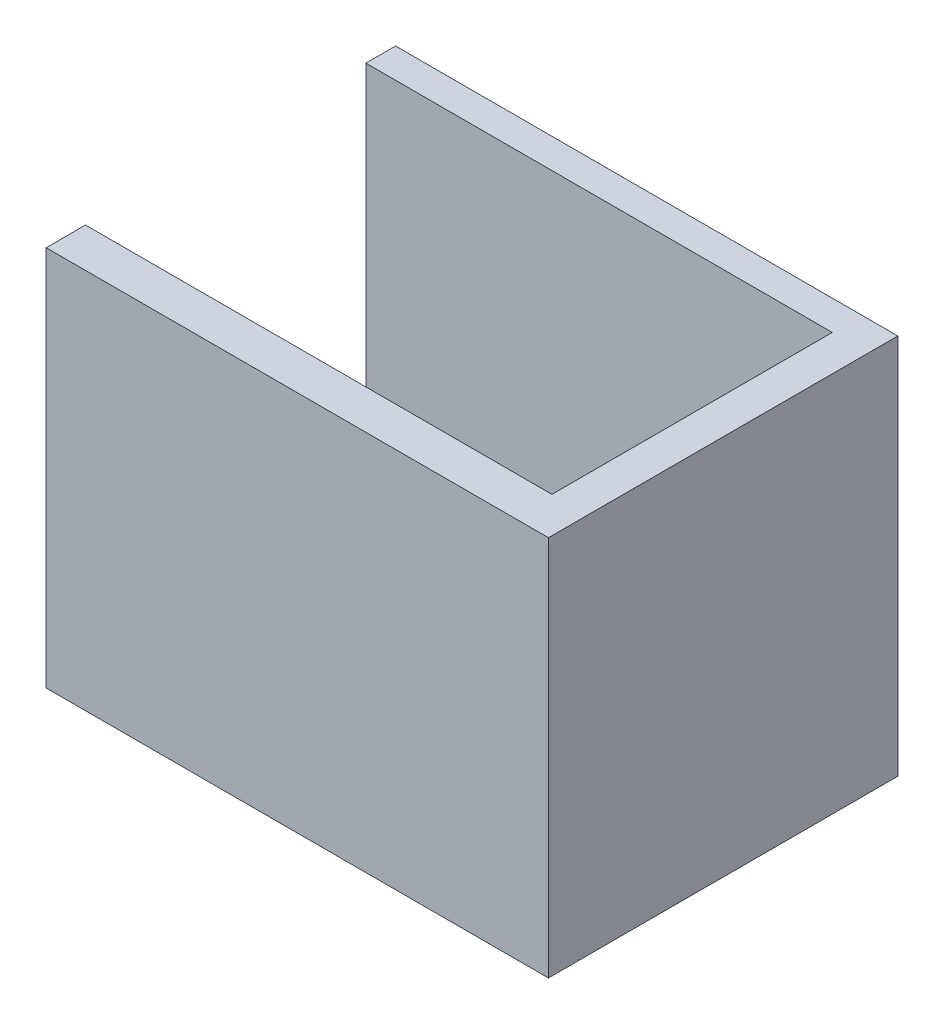
ISO-10303-21;
HEADER;
FILE_DESCRIPTION(('STEP AP214'),'2;1');
FILE_NAME('part.step','',(''),(''),'','','');
FILE_SCHEMA(('AUTOMOTIVE_DESIGN { 1 0 10303 214 1 1 1 1 }'));
ENDSEC;
DATA;
#1=APPLICATION_CONTEXT('core data for automotive mechanical design processes');
#2=APPLICATION_PROTOCOL_DEFINITION('international standard','automotive_design',2000,#1);
#3=PRODUCT_CONTEXT('',#1,'mechanical');
#4=PRODUCT('Part','Part','',(#3));
#5=PRODUCT_RELATED_PRODUCT_CATEGORY('part','',(#4));
#6=PRODUCT_DEFINITION_FORMATION('','',#4);
#7=PRODUCT_DEFINITION_CONTEXT('part definition',#1,'design');
#8=PRODUCT_DEFINITION('design','',#6,#7);
#9=PRODUCT_DEFINITION_SHAPE('','',#8);
#10=(LENGTH_UNIT() NAMED_UNIT(*) SI_UNIT(.MILLI.,.METRE.));
#11=(NAMED_UNIT(*) PLANE_ANGLE_UNIT() SI_UNIT($,.RADIAN.));
#12=(NAMED_UNIT(*) SI_UNIT($,.STERADIAN.) SOLID_ANGLE_UNIT());
#13=UNCERTAINTY_MEASURE_WITH_UNIT(LENGTH_MEASURE(1.E-05),#10,'distance_accuracy_value','');
#14=(GEOMETRIC_REPRESENTATION_CONTEXT(3) GLOBAL_UNCERTAINTY_ASSIGNED_CONTEXT((#13)) GLOBAL_UNIT_ASSIGNED_CONTEXT((#10,
#11,#12)) REPRESENTATION_CONTEXT('',''));
#15=CARTESIAN_POINT('',(0.,0.,0.));
#16=DIRECTION('',(0.,0.,1.));
#17=DIRECTION('',(1.,0.,0.));
#18=AXIS2_PLACEMENT_3D('',#15,#16,#17);
#19=CARTESIAN_POINT('',(-62.1250222775144,120.,-33.6739611902457));
#20=DIRECTION('',(0.,0.,-1.));
#21=DIRECTION('',(-1.,0.,0.));
#22=AXIS2_PLACEMENT_3D('',#19,#20,#21);
#23=PLANE('',#22);
#24=DIRECTION('',(-1.,0.,0.));
#25=VECTOR('',#24,1.);
#26=CARTESIAN_POINT('',(-62.1250222775144,5.,-33.6739611902457));
#27=LINE('',#26,#25);
#28=CARTESIAN_POINT('',(84.6659595640462,5.00000000000003,-33.6739611902457));
#29=VERTEX_POINT('',#28);
#30=CARTESIAN_POINT('',(-62.1250222775144,5.00000000000003,-33.6739611902457));
#31=VERTEX_POINT('',#30);
#32=EDGE_CURVE('E56',#29,#31,#27,.T.);
#33=ORIENTED_EDGE('',*,*,#32,.F.);
#34=DIRECTION('',(0.,-1.,0.));
#35=VECTOR('',#34,1.);
#36=CARTESIAN_POINT('',(84.6659595640462,120.,-33.6739611902457));
#37=LINE('',#36,#35);
#38=CARTESIAN_POINT('',(84.6659595640462,120.,-33.6739611902457));
#39=VERTEX_POINT('',#38);
#40=EDGE_CURVE('E47',#39,#29,#37,.T.);
#41=ORIENTED_EDGE('',*,*,#40,.F.);
#42=DIRECTION('',(1.,0.,0.));
#43=VECTOR('',#42,1.);
#44=CARTESIAN_POINT('',(-62.1250222775144,120.,-33.6739611902457));
#45=LINE('',#44,#43);
#46=CARTESIAN_POINT('',(-62.1250222775144,120.,-33.6739611902457));
#47=VERTEX_POINT('',#46);
#48=EDGE_CURVE('E98',#47,#39,#45,.T.);
#49=ORIENTED_EDGE('',*,*,#48,.F.);
#50=DIRECTION('',(0.,-1.,0.));
#51=VECTOR('',#50,1.);
#52=CARTESIAN_POINT('',(-62.1250222775144,120.,-33.6739611902457));
#53=LINE('',#52,#51);
#54=EDGE_CURVE('E11',#47,#31,#53,.T.);
#55=ORIENTED_EDGE('',*,*,#54,.T.);
#56=EDGE_LOOP('',(#33,#41,#49,#55));
#57=FACE_BOUND('',#56,.T.);
#58=ADVANCED_FACE('F39',(#57),#23,.F.);
#59=CARTESIAN_POINT('',(84.6659595640462,120.,-33.6739611902457));
#60=DIRECTION('',(1.,0.,0.));
#61=DIRECTION('',(0.,0.,-1.));
#62=AXIS2_PLACEMENT_3D('',#59,#60,#61);
#63=PLANE('',#62);
#64=DIRECTION('',(0.,0.,-1.));
#65=VECTOR('',#64,1.);
#66=CARTESIAN_POINT('',(84.6659595640462,5.,-33.6739611902457));
#67=LINE('',#66,#65);
#68=CARTESIAN_POINT('',(84.6659595640462,5.00000000000003,54.5655616021532));
#69=VERTEX_POINT('',#68);
#70=EDGE_CURVE('E130',#69,#29,#67,.T.);
#71=ORIENTED_EDGE('',*,*,#70,.F.);
#72=DIRECTION('',(0.,-1.,0.));
#73=VECTOR('',#72,1.);
#74=CARTESIAN_POINT('',(84.6659595640462,120.,54.5655616021532));
#75=LINE('',#74,#73);
#76=CARTESIAN_POINT('',(84.6659595640462,120.,54.5655616021532));
#77=VERTEX_POINT('',#76);
#78=EDGE_CURVE('E182',#77,#69,#75,.T.);
#79=ORIENTED_EDGE('',*,*,#78,.F.);
#80=DIRECTION('',(0.,0.,1.));
#81=VECTOR('',#80,1.);
#82=CARTESIAN_POINT('',(84.6659595640462,120.,-33.6739611902457));
#83=LINE('',#82,#81);
#84=EDGE_CURVE('E103',#39,#77,#83,.T.);
#85=ORIENTED_EDGE('',*,*,#84,.F.);
#86=ORIENTED_EDGE('',*,*,#40,.T.);
#87=EDGE_LOOP('',(#71,#79,#85,#86));
#88=FACE_BOUND('',#87,.T.);
#89=ADVANCED_FACE('F187',(#88),#63,.F.);
#90=CARTESIAN_POINT('',(84.6659595640462,120.,54.5655616021532));
#91=DIRECTION('',(0.,0.,1.));
#92=DIRECTION('',(1.,0.,0.));
#93=AXIS2_PLACEMENT_3D('',#90,#91,#92);
#94=PLANE('',#93);
#95=DIRECTION('',(1.,0.,0.));
#96=VECTOR('',#95,1.);
#97=CARTESIAN_POINT('',(84.6659595640462,5.,54.5655616021532));
#98=LINE('',#97,#96);
#99=CARTESIAN_POINT('',(-62.1250222775144,5.00000000000003,54.5655616021532));
#100=VERTEX_POINT('',#99);
#101=EDGE_CURVE('E127',#100,#69,#98,.T.);
#102=ORIENTED_EDGE('',*,*,#101,.F.);
#103=DIRECTION('',(0.,-1.,0.));
#104=VECTOR('',#103,1.);
#105=CARTESIAN_POINT('',(-62.1250222775144,120.,54.5655616021532));
#106=LINE('',#105,#104);
#107=CARTESIAN_POINT('',(-62.1250222775144,120.,54.5655616021532));
#108=VERTEX_POINT('',#107);
#109=EDGE_CURVE('E123',#108,#100,#106,.T.);
#110=ORIENTED_EDGE('',*,*,#109,.F.);
#111=DIRECTION('',(-1.,0.,0.));
#112=VECTOR('',#111,1.);
#113=CARTESIAN_POINT('',(84.6659595640462,120.,54.5655616021532));
#114=LINE('',#113,#112);
#115=EDGE_CURVE('E141',#77,#108,#114,.T.);
#116=ORIENTED_EDGE('',*,*,#115,.F.);
#117=ORIENTED_EDGE('',*,*,#78,.T.);
#118=EDGE_LOOP('',(#102,#110,#116,#117));
#119=FACE_BOUND('',#118,.T.);
#120=ADVANCED_FACE('F191',(#119),#94,.F.);
#121=CARTESIAN_POINT('',(-62.1250222775144,120.,54.5655616021532));
#122=DIRECTION('',(1.,0.,0.));
#123=DIRECTION('',(0.,0.,-1.));
#124=AXIS2_PLACEMENT_3D('',#121,#122,#123);
#125=PLANE('',#124);
#126=DIRECTION('',(0.,0.,1.));
#127=VECTOR('',#126,1.);
#128=CARTESIAN_POINT('',(-62.1250222775144,0.,54.5655616021532));
#129=LINE('',#128,#127);
#130=CARTESIAN_POINT('',(-62.1250222775144,0.,-43.0202034797832));
#131=VERTEX_POINT('',#130);
#132=CARTESIAN_POINT('',(-62.1250222775144,0.,66.9355881618352));
#133=VERTEX_POINT('',#132);
#134=EDGE_CURVE('E137',#131,#133,#129,.T.);
#135=ORIENTED_EDGE('',*,*,#134,.T.);
#136=DIRECTION('',(0.,-1.,0.));
#137=VECTOR('',#136,1.);
#138=CARTESIAN_POINT('',(-62.1250222775144,120.,66.9355881618352));
#139=LINE('',#138,#137);
#140=CARTESIAN_POINT('',(-62.1250222775144,120.,66.9355881618352));
#141=VERTEX_POINT('',#140);
#142=EDGE_CURVE('E177',#141,#133,#139,.T.);
#143=ORIENTED_EDGE('',*,*,#142,.F.);
#144=DIRECTION('',(0.,0.,1.));
#145=VECTOR('',#144,1.);
#146=CARTESIAN_POINT('',(-62.1250222775144,120.,54.5655616021532));
#147=LINE('',#146,#145);
#148=EDGE_CURVE('E144',#108,#141,#147,.T.);
#149=ORIENTED_EDGE('',*,*,#148,.F.);
#150=ORIENTED_EDGE('',*,*,#109,.T.);
#151=DIRECTION('',(0.,0.,-1.));
#152=VECTOR('',#151,1.);
#153=CARTESIAN_POINT('',(-62.1250222775144,5.,66.9355881618352));
#154=LINE('',#153,#152);
#155=EDGE_CURVE('E120',#100,#31,#154,.T.);
#156=ORIENTED_EDGE('',*,*,#155,.T.);
#157=ORIENTED_EDGE('',*,*,#54,.F.);
#158=DIRECTION('',(0.,0.,1.));
#159=VECTOR('',#158,1.);
#160=CARTESIAN_POINT('',(-62.1250222775144,120.,-43.0202034797832));
#161=LINE('',#160,#159);
#162=CARTESIAN_POINT('',(-62.1250222775144,120.,-43.0202034797832));
#163=VERTEX_POINT('',#162);
#164=EDGE_CURVE('E104',#163,#47,#161,.T.);
#165=ORIENTED_EDGE('',*,*,#164,.F.);
#166=DIRECTION('',(0.,-1.,0.));
#167=VECTOR('',#166,1.);
#168=CARTESIAN_POINT('',(-62.1250222775144,120.,-43.0202034797832));
#169=LINE('',#168,#167);
#170=EDGE_CURVE('E155',#163,#131,#169,.T.);
#171=ORIENTED_EDGE('',*,*,#170,.T.);
#172=EDGE_LOOP('',(#135,#143,#149,#150,#156,#157,#165,#171));
#173=FACE_BOUND('',#172,.T.);
#174=ADVANCED_FACE('F117',(#173),#125,.F.);
#175=CARTESIAN_POINT('',(-62.1250222775144,120.,66.9355881618352));
#176=DIRECTION('',(0.,0.,-1.));
#177=DIRECTION('',(-1.,0.,0.));
#178=AXIS2_PLACEMENT_3D('',#175,#176,#177);
#179=PLANE('',#178);
#180=DIRECTION('',(1.,0.,0.));
#181=VECTOR('',#180,1.);
#182=CARTESIAN_POINT('',(-62.1250222775144,0.,66.9355881618352));
#183=LINE('',#182,#181);
#184=CARTESIAN_POINT('',(95.9364282073121,0.,66.9355881618352));
#185=VERTEX_POINT('',#184);
#186=EDGE_CURVE('E158',#133,#185,#183,.T.);
#187=ORIENTED_EDGE('',*,*,#186,.T.);
#188=DIRECTION('',(0.,-1.,0.));
#189=VECTOR('',#188,1.);
#190=CARTESIAN_POINT('',(95.9364282073121,120.,66.9355881618352));
#191=LINE('',#190,#189);
#192=CARTESIAN_POINT('',(95.9364282073121,120.,66.9355881618352));
#193=VERTEX_POINT('',#192);
#194=EDGE_CURVE('E174',#193,#185,#191,.T.);
#195=ORIENTED_EDGE('',*,*,#194,.F.);
#196=DIRECTION('',(1.,0.,0.));
#197=VECTOR('',#196,1.);
#198=CARTESIAN_POINT('',(-62.1250222775144,120.,66.9355881618352));
#199=LINE('',#198,#197);
#200=EDGE_CURVE('E147',#141,#193,#199,.T.);
#201=ORIENTED_EDGE('',*,*,#200,.F.);
#202=ORIENTED_EDGE('',*,*,#142,.T.);
#203=EDGE_LOOP('',(#187,#195,#201,#202));
#204=FACE_BOUND('',#203,.T.);
#205=ADVANCED_FACE('F199',(#204),#179,.F.);
#206=CARTESIAN_POINT('',(95.9364282073121,120.,-43.0202034797832));
#207=DIRECTION('',(-1.,0.,0.));
#208=DIRECTION('',(0.,0.,1.));
#209=AXIS2_PLACEMENT_3D('',#206,#207,#208);
#210=PLANE('',#209);
#211=DIRECTION('',(0.,0.,-1.));
#212=VECTOR('',#211,1.);
#213=CARTESIAN_POINT('',(95.9364282073121,0.,-43.0202034797832));
#214=LINE('',#213,#212);
#215=CARTESIAN_POINT('',(95.9364282073121,0.,-43.0202034797832));
#216=VERTEX_POINT('',#215);
#217=EDGE_CURVE('E162',#185,#216,#214,.T.);
#218=ORIENTED_EDGE('',*,*,#217,.T.);
#219=DIRECTION('',(0.,-1.,0.));
#220=VECTOR('',#219,1.);
#221=CARTESIAN_POINT('',(95.9364282073121,120.,-43.0202034797832));
#222=LINE('',#221,#220);
#223=CARTESIAN_POINT('',(95.9364282073121,120.,-43.0202034797832));
#224=VERTEX_POINT('',#223);
#225=EDGE_CURVE('E171',#224,#216,#222,.T.);
#226=ORIENTED_EDGE('',*,*,#225,.F.);
#227=DIRECTION('',(0.,0.,-1.));
#228=VECTOR('',#227,1.);
#229=CARTESIAN_POINT('',(95.9364282073121,120.,-43.0202034797832));
#230=LINE('',#229,#228);
#231=EDGE_CURVE('E150',#193,#224,#230,.T.);
#232=ORIENTED_EDGE('',*,*,#231,.F.);
#233=ORIENTED_EDGE('',*,*,#194,.T.);
#234=EDGE_LOOP('',(#218,#226,#232,#233));
#235=FACE_BOUND('',#234,.T.);
#236=ADVANCED_FACE('F204',(#235),#210,.F.);
#237=CARTESIAN_POINT('',(-62.1250222775144,120.,-43.0202034797832));
#238=DIRECTION('',(0.,0.,1.));
#239=DIRECTION('',(1.,0.,0.));
#240=AXIS2_PLACEMENT_3D('',#237,#238,#239);
#241=PLANE('',#240);
#242=DIRECTION('',(-1.,0.,0.));
#243=VECTOR('',#242,1.);
#244=CARTESIAN_POINT('',(-62.1250222775144,0.,-43.0202034797832));
#245=LINE('',#244,#243);
#246=EDGE_CURVE('E113',#216,#131,#245,.T.);
#247=ORIENTED_EDGE('',*,*,#246,.T.);
#248=ORIENTED_EDGE('',*,*,#170,.F.);
#249=DIRECTION('',(-1.,0.,0.));
#250=VECTOR('',#249,1.);
#251=CARTESIAN_POINT('',(-62.1250222775144,120.,-43.0202034797832));
#252=LINE('',#251,#250);
#253=EDGE_CURVE('E109',#224,#163,#252,.T.);
#254=ORIENTED_EDGE('',*,*,#253,.F.);
#255=ORIENTED_EDGE('',*,*,#225,.T.);
#256=EDGE_LOOP('',(#247,#248,#254,#255));
#257=FACE_BOUND('',#256,.T.);
#258=ADVANCED_FACE('F207',(#257),#241,.F.);
#259=CARTESIAN_POINT('',(0.,120.,0.));
#260=DIRECTION('',(0.,1.,0.));
#261=DIRECTION('',(0.,0.,1.));
#262=AXIS2_PLACEMENT_3D('',#259,#260,#261);
#263=PLANE('',#262);
#264=ORIENTED_EDGE('',*,*,#164,.T.);
#265=ORIENTED_EDGE('',*,*,#48,.T.);
#266=ORIENTED_EDGE('',*,*,#84,.T.);
#267=ORIENTED_EDGE('',*,*,#115,.T.);
#268=ORIENTED_EDGE('',*,*,#148,.T.);
#269=ORIENTED_EDGE('',*,*,#200,.T.);
#270=ORIENTED_EDGE('',*,*,#231,.T.);
#271=ORIENTED_EDGE('',*,*,#253,.T.);
#272=EDGE_LOOP('',(#264,#265,#266,#267,#268,#269,#270,#271));
#273=FACE_BOUND('',#272,.T.);
#274=ADVANCED_FACE('F107',(#273),#263,.T.);
#275=CARTESIAN_POINT('',(0.,0.,0.));
#276=DIRECTION('',(0.,1.,0.));
#277=DIRECTION('',(0.,0.,1.));
#278=AXIS2_PLACEMENT_3D('',#275,#276,#277);
#279=PLANE('',#278);
#280=ORIENTED_EDGE('',*,*,#134,.F.);
#281=ORIENTED_EDGE('',*,*,#246,.F.);
#282=ORIENTED_EDGE('',*,*,#217,.F.);
#283=ORIENTED_EDGE('',*,*,#186,.F.);
#284=EDGE_LOOP('',(#280,#281,#282,#283));
#285=FACE_BOUND('',#284,.T.);
#286=ADVANCED_FACE('F209',(#285),#279,.F.);
#287=CARTESIAN_POINT('',(0.,5.,0.));
#288=DIRECTION('',(0.,-1.,0.));
#289=DIRECTION('',(0.,0.,-1.));
#290=AXIS2_PLACEMENT_3D('',#287,#288,#289);
#291=PLANE('',#290);
#292=ORIENTED_EDGE('',*,*,#70,.T.);
#293=ORIENTED_EDGE('',*,*,#32,.T.);
#294=ORIENTED_EDGE('',*,*,#155,.F.);
#295=ORIENTED_EDGE('',*,*,#101,.T.);
#296=EDGE_LOOP('',(#292,#293,#294,#295));
#297=FACE_BOUND('',#296,.T.);
#298=ADVANCED_FACE('F189',(#297),#291,.F.);
#299=CLOSED_SHELL('',(#58,#89,#120,#174,#205,#236,#258,#274,#286,#298));
#300=MANIFOLD_SOLID_BREP('B2',#299);
#301=ADVANCED_BREP_SHAPE_REPRESENTATION('',(#18,#300),#14);
#302=SHAPE_DEFINITION_REPRESENTATION(#9,#301);
ENDSEC;
END-ISO-10303-21;
